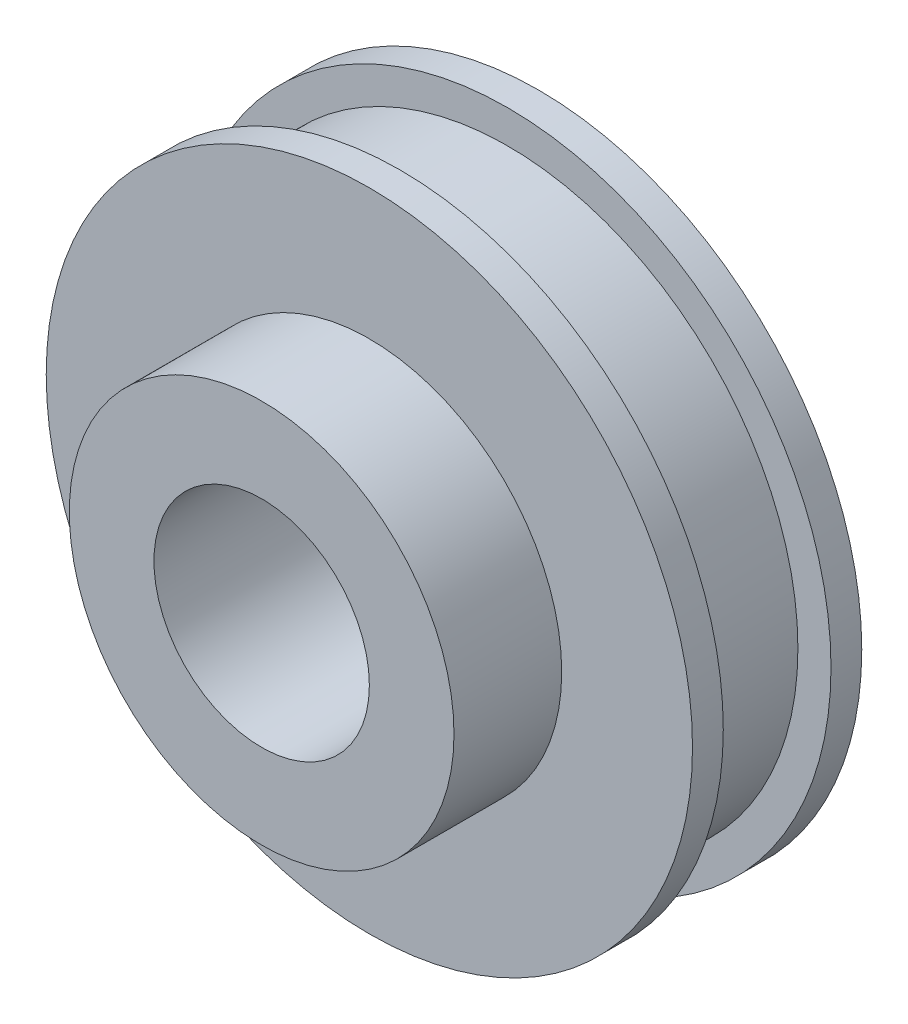
ISO-10303-21;
HEADER;
FILE_DESCRIPTION(('STEP AP214'),'2;1');
FILE_NAME('part.step','',(''),(''),'','','');
FILE_SCHEMA(('AUTOMOTIVE_DESIGN { 1 0 10303 214 1 1 1 1 }'));
ENDSEC;
DATA;
#1=APPLICATION_CONTEXT('core data for automotive mechanical design processes');
#2=APPLICATION_PROTOCOL_DEFINITION('international standard','automotive_design',2000,#1);
#3=PRODUCT_CONTEXT('',#1,'mechanical');
#4=PRODUCT('Part','Part','',(#3));
#5=PRODUCT_RELATED_PRODUCT_CATEGORY('part','',(#4));
#6=PRODUCT_DEFINITION_FORMATION('','',#4);
#7=PRODUCT_DEFINITION_CONTEXT('part definition',#1,'design');
#8=PRODUCT_DEFINITION('design','',#6,#7);
#9=PRODUCT_DEFINITION_SHAPE('','',#8);
#10=(LENGTH_UNIT() NAMED_UNIT(*) SI_UNIT(.MILLI.,.METRE.));
#11=(NAMED_UNIT(*) PLANE_ANGLE_UNIT() SI_UNIT($,.RADIAN.));
#12=(NAMED_UNIT(*) SI_UNIT($,.STERADIAN.) SOLID_ANGLE_UNIT());
#13=UNCERTAINTY_MEASURE_WITH_UNIT(LENGTH_MEASURE(1.E-05),#10,'distance_accuracy_value','');
#14=(GEOMETRIC_REPRESENTATION_CONTEXT(3) GLOBAL_UNCERTAINTY_ASSIGNED_CONTEXT((#13)) GLOBAL_UNIT_ASSIGNED_CONTEXT((#10,
#11,#12)) REPRESENTATION_CONTEXT('',''));
#15=CARTESIAN_POINT('',(0.,0.,0.));
#16=DIRECTION('',(0.,0.,1.));
#17=DIRECTION('',(1.,0.,0.));
#18=AXIS2_PLACEMENT_3D('',#15,#16,#17);
#19=CARTESIAN_POINT('',(0.,0.,2.));
#20=DIRECTION('',(0.,0.,-1.));
#21=DIRECTION('',(-1.,0.,0.));
#22=AXIS2_PLACEMENT_3D('',#19,#20,#21);
#23=CYLINDRICAL_SURFACE('',#22,21.);
#24=CARTESIAN_POINT('',(0.,0.,2.));
#25=DIRECTION('',(0.,0.,1.));
#26=DIRECTION('',(1.,0.,0.));
#27=AXIS2_PLACEMENT_3D('',#24,#25,#26);
#28=CIRCLE('',#27,21.);
#29=CARTESIAN_POINT('',(21.,0.,2.));
#30=VERTEX_POINT('',#29);
#31=EDGE_CURVE('E45',#30,#30,#28,.T.);
#32=ORIENTED_EDGE('',*,*,#31,.F.);
#33=EDGE_LOOP('',(#32));
#34=FACE_BOUND('',#33,.T.);
#35=CARTESIAN_POINT('',(0.,0.,0.));
#36=DIRECTION('',(0.,0.,1.));
#37=DIRECTION('',(1.,0.,0.));
#38=AXIS2_PLACEMENT_3D('',#35,#36,#37);
#39=CIRCLE('',#38,21.);
#40=CARTESIAN_POINT('',(21.,0.,0.));
#41=VERTEX_POINT('',#40);
#42=EDGE_CURVE('E36',#41,#41,#39,.T.);
#43=ORIENTED_EDGE('',*,*,#42,.T.);
#44=EDGE_LOOP('',(#43));
#45=FACE_BOUND('',#44,.T.);
#46=ADVANCED_FACE('F33',(#34,#45),#23,.T.);
#47=CARTESIAN_POINT('',(0.,0.,2.));
#48=DIRECTION('',(0.,0.,1.));
#49=DIRECTION('',(1.,0.,0.));
#50=AXIS2_PLACEMENT_3D('',#47,#48,#49);
#51=PLANE('',#50);
#52=CARTESIAN_POINT('',(0.,0.,2.));
#53=DIRECTION('',(0.,0.,1.));
#54=DIRECTION('',(1.,0.,0.));
#55=AXIS2_PLACEMENT_3D('',#52,#53,#54);
#56=CIRCLE('',#55,18.85);
#57=CARTESIAN_POINT('',(18.85,0.,2.));
#58=VERTEX_POINT('',#57);
#59=EDGE_CURVE('E40',#58,#58,#56,.T.);
#60=ORIENTED_EDGE('',*,*,#59,.F.);
#61=EDGE_LOOP('',(#60));
#62=FACE_BOUND('',#61,.T.);
#63=ORIENTED_EDGE('',*,*,#31,.T.);
#64=EDGE_LOOP('',(#63));
#65=FACE_BOUND('',#64,.T.);
#66=ADVANCED_FACE('F69',(#62,#65),#51,.T.);
#67=CARTESIAN_POINT('',(0.,0.,0.));
#68=DIRECTION('',(0.,0.,1.));
#69=DIRECTION('',(1.,0.,0.));
#70=AXIS2_PLACEMENT_3D('',#67,#68,#69);
#71=PLANE('',#70);
#72=CARTESIAN_POINT('',(0.,0.,0.));
#73=DIRECTION('',(0.,0.,1.));
#74=DIRECTION('',(1.,0.,0.));
#75=AXIS2_PLACEMENT_3D('',#72,#73,#74);
#76=CIRCLE('',#75,7.);
#77=CARTESIAN_POINT('',(7.,0.,0.));
#78=VERTEX_POINT('',#77);
#79=EDGE_CURVE('E164',#78,#78,#76,.T.);
#80=ORIENTED_EDGE('',*,*,#79,.T.);
#81=EDGE_LOOP('',(#80));
#82=FACE_BOUND('',#81,.T.);
#83=ORIENTED_EDGE('',*,*,#42,.F.);
#84=EDGE_LOOP('',(#83));
#85=FACE_BOUND('',#84,.T.);
#86=ADVANCED_FACE('F66',(#82,#85),#71,.F.);
#87=CARTESIAN_POINT('',(0.,0.,9.));
#88=DIRECTION('',(0.,0.,-1.));
#89=DIRECTION('',(-1.,0.,0.));
#90=AXIS2_PLACEMENT_3D('',#87,#88,#89);
#91=CYLINDRICAL_SURFACE('',#90,18.85);
#92=CARTESIAN_POINT('',(0.,0.,9.));
#93=DIRECTION('',(0.,0.,1.));
#94=DIRECTION('',(1.,0.,0.));
#95=AXIS2_PLACEMENT_3D('',#92,#93,#94);
#96=CIRCLE('',#95,18.85);
#97=CARTESIAN_POINT('',(18.85,0.,9.));
#98=VERTEX_POINT('',#97);
#99=EDGE_CURVE('E54',#98,#98,#96,.T.);
#100=ORIENTED_EDGE('',*,*,#99,.F.);
#101=EDGE_LOOP('',(#100));
#102=FACE_BOUND('',#101,.T.);
#103=ORIENTED_EDGE('',*,*,#59,.T.);
#104=EDGE_LOOP('',(#103));
#105=FACE_BOUND('',#104,.T.);
#106=ADVANCED_FACE('F68',(#102,#105),#91,.T.);
#107=CARTESIAN_POINT('',(0.,0.,11.));
#108=DIRECTION('',(0.,0.,-1.));
#109=DIRECTION('',(-1.,0.,0.));
#110=AXIS2_PLACEMENT_3D('',#107,#108,#109);
#111=CYLINDRICAL_SURFACE('',#110,21.);
#112=CARTESIAN_POINT('',(0.,0.,11.));
#113=DIRECTION('',(0.,0.,1.));
#114=DIRECTION('',(1.,0.,0.));
#115=AXIS2_PLACEMENT_3D('',#112,#113,#114);
#116=CIRCLE('',#115,21.);
#117=CARTESIAN_POINT('',(21.,0.,11.));
#118=VERTEX_POINT('',#117);
#119=EDGE_CURVE('E51',#118,#118,#116,.T.);
#120=ORIENTED_EDGE('',*,*,#119,.F.);
#121=EDGE_LOOP('',(#120));
#122=FACE_BOUND('',#121,.T.);
#123=CARTESIAN_POINT('',(0.,0.,9.));
#124=DIRECTION('',(0.,0.,1.));
#125=DIRECTION('',(1.,0.,0.));
#126=AXIS2_PLACEMENT_3D('',#123,#124,#125);
#127=CIRCLE('',#126,21.);
#128=CARTESIAN_POINT('',(21.,0.,9.));
#129=VERTEX_POINT('',#128);
#130=EDGE_CURVE('E55',#129,#129,#127,.T.);
#131=ORIENTED_EDGE('',*,*,#130,.T.);
#132=EDGE_LOOP('',(#131));
#133=FACE_BOUND('',#132,.T.);
#134=ADVANCED_FACE('F75',(#122,#133),#111,.T.);
#135=CARTESIAN_POINT('',(0.,0.,11.));
#136=DIRECTION('',(0.,0.,1.));
#137=DIRECTION('',(1.,0.,0.));
#138=AXIS2_PLACEMENT_3D('',#135,#136,#137);
#139=PLANE('',#138);
#140=CARTESIAN_POINT('',(0.,0.,11.));
#141=DIRECTION('',(0.,0.,1.));
#142=DIRECTION('',(1.,0.,0.));
#143=AXIS2_PLACEMENT_3D('',#140,#141,#142);
#144=CIRCLE('',#143,12.5);
#145=CARTESIAN_POINT('',(12.5,0.,11.));
#146=VERTEX_POINT('',#145);
#147=EDGE_CURVE('E10',#146,#146,#144,.T.);
#148=ORIENTED_EDGE('',*,*,#147,.F.);
#149=EDGE_LOOP('',(#148));
#150=FACE_BOUND('',#149,.T.);
#151=ORIENTED_EDGE('',*,*,#119,.T.);
#152=EDGE_LOOP('',(#151));
#153=FACE_BOUND('',#152,.T.);
#154=ADVANCED_FACE('F105',(#150,#153),#139,.T.);
#155=CARTESIAN_POINT('',(0.,0.,9.));
#156=DIRECTION('',(0.,0.,1.));
#157=DIRECTION('',(1.,0.,0.));
#158=AXIS2_PLACEMENT_3D('',#155,#156,#157);
#159=PLANE('',#158);
#160=ORIENTED_EDGE('',*,*,#99,.T.);
#161=EDGE_LOOP('',(#160));
#162=FACE_BOUND('',#161,.T.);
#163=ORIENTED_EDGE('',*,*,#130,.F.);
#164=EDGE_LOOP('',(#163));
#165=FACE_BOUND('',#164,.T.);
#166=ADVANCED_FACE('F113',(#162,#165),#159,.F.);
#167=CARTESIAN_POINT('',(0.,0.,18.));
#168=DIRECTION('',(0.,0.,-1.));
#169=DIRECTION('',(-1.,0.,0.));
#170=AXIS2_PLACEMENT_3D('',#167,#168,#169);
#171=CYLINDRICAL_SURFACE('',#170,12.5);
#172=CARTESIAN_POINT('',(0.,0.,18.));
#173=DIRECTION('',(0.,0.,1.));
#174=DIRECTION('',(1.,0.,0.));
#175=AXIS2_PLACEMENT_3D('',#172,#173,#174);
#176=CIRCLE('',#175,12.5);
#177=CARTESIAN_POINT('',(12.5,0.,18.));
#178=VERTEX_POINT('',#177);
#179=EDGE_CURVE('E49',#178,#178,#176,.T.);
#180=ORIENTED_EDGE('',*,*,#179,.F.);
#181=EDGE_LOOP('',(#180));
#182=FACE_BOUND('',#181,.T.);
#183=ORIENTED_EDGE('',*,*,#147,.T.);
#184=EDGE_LOOP('',(#183));
#185=FACE_BOUND('',#184,.T.);
#186=ADVANCED_FACE('F118',(#182,#185),#171,.T.);
#187=CARTESIAN_POINT('',(0.,0.,18.));
#188=DIRECTION('',(0.,0.,1.));
#189=DIRECTION('',(1.,0.,0.));
#190=AXIS2_PLACEMENT_3D('',#187,#188,#189);
#191=PLANE('',#190);
#192=CARTESIAN_POINT('',(0.,0.,18.));
#193=DIRECTION('',(0.,0.,1.));
#194=DIRECTION('',(1.,0.,0.));
#195=AXIS2_PLACEMENT_3D('',#192,#193,#194);
#196=CIRCLE('',#195,7.);
#197=CARTESIAN_POINT('',(7.,0.,18.));
#198=VERTEX_POINT('',#197);
#199=EDGE_CURVE('E167',#198,#198,#196,.T.);
#200=ORIENTED_EDGE('',*,*,#199,.F.);
#201=EDGE_LOOP('',(#200));
#202=FACE_BOUND('',#201,.T.);
#203=ORIENTED_EDGE('',*,*,#179,.T.);
#204=EDGE_LOOP('',(#203));
#205=FACE_BOUND('',#204,.T.);
#206=ADVANCED_FACE('F134',(#202,#205),#191,.T.);
#207=CARTESIAN_POINT('',(0.,0.,0.));
#208=DIRECTION('',(0.,0.,1.));
#209=DIRECTION('',(1.,0.,0.));
#210=AXIS2_PLACEMENT_3D('',#207,#208,#209);
#211=CYLINDRICAL_SURFACE('',#210,7.);
#212=ORIENTED_EDGE('',*,*,#79,.F.);
#213=EDGE_LOOP('',(#212));
#214=FACE_BOUND('',#213,.T.);
#215=ORIENTED_EDGE('',*,*,#199,.T.);
#216=EDGE_LOOP('',(#215));
#217=FACE_BOUND('',#216,.T.);
#218=ADVANCED_FACE('F148',(#214,#217),#211,.F.);
#219=CLOSED_SHELL('',(#46,#66,#86,#106,#134,#154,#166,#186,#206,#218));
#220=MANIFOLD_SOLID_BREP('B2',#219);
#221=ADVANCED_BREP_SHAPE_REPRESENTATION('',(#18,#220),#14);
#222=SHAPE_DEFINITION_REPRESENTATION(#9,#221);
ENDSEC;
END-ISO-10303-21;
